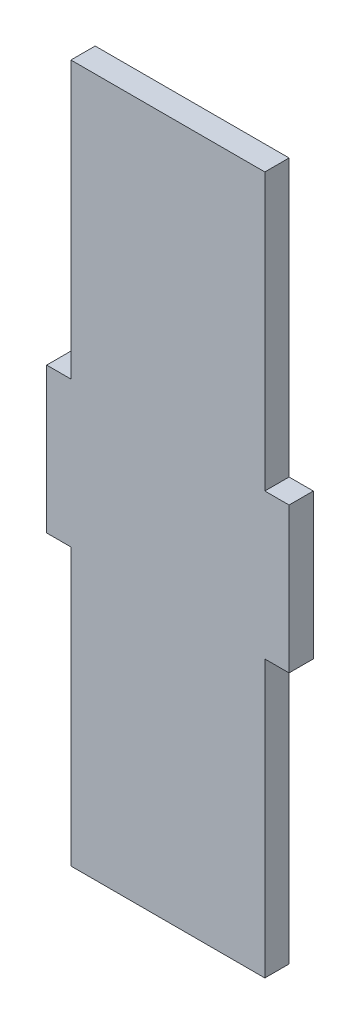
ISO-10303-21;
HEADER;
FILE_DESCRIPTION(('STEP AP214'),'2;1');
FILE_NAME('part.step','',(''),(''),'','','');
FILE_SCHEMA(('AUTOMOTIVE_DESIGN { 1 0 10303 214 1 1 1 1 }'));
ENDSEC;
DATA;
#1=APPLICATION_CONTEXT('core data for automotive mechanical design processes');
#2=APPLICATION_PROTOCOL_DEFINITION('international standard','automotive_design',2000,#1);
#3=PRODUCT_CONTEXT('',#1,'mechanical');
#4=PRODUCT('Part','Part','',(#3));
#5=PRODUCT_RELATED_PRODUCT_CATEGORY('part','',(#4));
#6=PRODUCT_DEFINITION_FORMATION('','',#4);
#7=PRODUCT_DEFINITION_CONTEXT('part definition',#1,'design');
#8=PRODUCT_DEFINITION('design','',#6,#7);
#9=PRODUCT_DEFINITION_SHAPE('','',#8);
#10=(LENGTH_UNIT() NAMED_UNIT(*) SI_UNIT(.MILLI.,.METRE.));
#11=(NAMED_UNIT(*) PLANE_ANGLE_UNIT() SI_UNIT($,.RADIAN.));
#12=(NAMED_UNIT(*) SI_UNIT($,.STERADIAN.) SOLID_ANGLE_UNIT());
#13=UNCERTAINTY_MEASURE_WITH_UNIT(LENGTH_MEASURE(1.E-05),#10,'distance_accuracy_value','');
#14=(GEOMETRIC_REPRESENTATION_CONTEXT(3) GLOBAL_UNCERTAINTY_ASSIGNED_CONTEXT((#13)) GLOBAL_UNIT_ASSIGNED_CONTEXT((#10,
#11,#12)) REPRESENTATION_CONTEXT('',''));
#15=CARTESIAN_POINT('',(0.,0.,0.));
#16=DIRECTION('',(0.,0.,1.));
#17=DIRECTION('',(1.,0.,0.));
#18=AXIS2_PLACEMENT_3D('',#15,#16,#17);
#19=CARTESIAN_POINT('',(20.,15.,5.));
#20=DIRECTION('',(-1.,0.,0.));
#21=DIRECTION('',(0.,0.,1.));
#22=AXIS2_PLACEMENT_3D('',#19,#20,#21);
#23=PLANE('',#22);
#24=DIRECTION('',(0.,1.,0.));
#25=VECTOR('',#24,1.);
#26=CARTESIAN_POINT('',(20.,15.,0.));
#27=LINE('',#26,#25);
#28=CARTESIAN_POINT('',(20.,15.,0.));
#29=VERTEX_POINT('',#28);
#30=CARTESIAN_POINT('',(20.,72.,0.));
#31=VERTEX_POINT('',#30);
#32=EDGE_CURVE('E153',#29,#31,#27,.T.);
#33=ORIENTED_EDGE('',*,*,#32,.T.);
#34=DIRECTION('',(0.,0.,-1.));
#35=VECTOR('',#34,1.);
#36=CARTESIAN_POINT('',(20.,72.,5.));
#37=LINE('',#36,#35);
#38=CARTESIAN_POINT('',(20.,72.,5.));
#39=VERTEX_POINT('',#38);
#40=EDGE_CURVE('E11',#39,#31,#37,.T.);
#41=ORIENTED_EDGE('',*,*,#40,.F.);
#42=DIRECTION('',(0.,1.,0.));
#43=VECTOR('',#42,1.);
#44=CARTESIAN_POINT('',(20.,15.,5.));
#45=LINE('',#44,#43);
#46=CARTESIAN_POINT('',(20.,15.,5.));
#47=VERTEX_POINT('',#46);
#48=EDGE_CURVE('E175',#47,#39,#45,.T.);
#49=ORIENTED_EDGE('',*,*,#48,.F.);
#50=DIRECTION('',(0.,0.,-1.));
#51=VECTOR('',#50,1.);
#52=CARTESIAN_POINT('',(20.,15.,5.));
#53=LINE('',#52,#51);
#54=EDGE_CURVE('E149',#47,#29,#53,.T.);
#55=ORIENTED_EDGE('',*,*,#54,.T.);
#56=EDGE_LOOP('',(#33,#41,#49,#55));
#57=FACE_BOUND('',#56,.T.);
#58=ADVANCED_FACE('F33',(#57),#23,.F.);
#59=CARTESIAN_POINT('',(-20.,72.,5.));
#60=DIRECTION('',(0.,-1.,0.));
#61=DIRECTION('',(0.,0.,-1.));
#62=AXIS2_PLACEMENT_3D('',#59,#60,#61);
#63=PLANE('',#62);
#64=DIRECTION('',(-1.,0.,0.));
#65=VECTOR('',#64,1.);
#66=CARTESIAN_POINT('',(-20.,72.,0.));
#67=LINE('',#66,#65);
#68=CARTESIAN_POINT('',(-20.,72.,0.));
#69=VERTEX_POINT('',#68);
#70=EDGE_CURVE('E156',#31,#69,#67,.T.);
#71=ORIENTED_EDGE('',*,*,#70,.T.);
#72=DIRECTION('',(0.,0.,-1.));
#73=VECTOR('',#72,1.);
#74=CARTESIAN_POINT('',(-20.,72.,5.));
#75=LINE('',#74,#73);
#76=CARTESIAN_POINT('',(-20.,72.,5.));
#77=VERTEX_POINT('',#76);
#78=EDGE_CURVE('E41',#77,#69,#75,.T.);
#79=ORIENTED_EDGE('',*,*,#78,.F.);
#80=DIRECTION('',(-1.,0.,0.));
#81=VECTOR('',#80,1.);
#82=CARTESIAN_POINT('',(-20.,72.,5.));
#83=LINE('',#82,#81);
#84=EDGE_CURVE('E104',#39,#77,#83,.T.);
#85=ORIENTED_EDGE('',*,*,#84,.F.);
#86=ORIENTED_EDGE('',*,*,#40,.T.);
#87=EDGE_LOOP('',(#71,#79,#85,#86));
#88=FACE_BOUND('',#87,.T.);
#89=ADVANCED_FACE('F253',(#88),#63,.F.);
#90=CARTESIAN_POINT('',(-20.,15.,5.));
#91=DIRECTION('',(1.,0.,0.));
#92=DIRECTION('',(0.,0.,-1.));
#93=AXIS2_PLACEMENT_3D('',#90,#91,#92);
#94=PLANE('',#93);
#95=DIRECTION('',(0.,-1.,0.));
#96=VECTOR('',#95,1.);
#97=CARTESIAN_POINT('',(-20.,15.,0.));
#98=LINE('',#97,#96);
#99=CARTESIAN_POINT('',(-20.,15.,0.));
#100=VERTEX_POINT('',#99);
#101=EDGE_CURVE('E158',#69,#100,#98,.T.);
#102=ORIENTED_EDGE('',*,*,#101,.T.);
#103=DIRECTION('',(0.,0.,-1.));
#104=VECTOR('',#103,1.);
#105=CARTESIAN_POINT('',(-20.,15.,5.));
#106=LINE('',#105,#104);
#107=CARTESIAN_POINT('',(-20.,15.,5.));
#108=VERTEX_POINT('',#107);
#109=EDGE_CURVE('E194',#108,#100,#106,.T.);
#110=ORIENTED_EDGE('',*,*,#109,.F.);
#111=DIRECTION('',(0.,-1.,0.));
#112=VECTOR('',#111,1.);
#113=CARTESIAN_POINT('',(-20.,15.,5.));
#114=LINE('',#113,#112);
#115=EDGE_CURVE('E202',#77,#108,#114,.T.);
#116=ORIENTED_EDGE('',*,*,#115,.F.);
#117=ORIENTED_EDGE('',*,*,#78,.T.);
#118=EDGE_LOOP('',(#102,#110,#116,#117));
#119=FACE_BOUND('',#118,.T.);
#120=ADVANCED_FACE('F200',(#119),#94,.F.);
#121=CARTESIAN_POINT('',(-20.,15.,5.));
#122=DIRECTION('',(0.,-1.,0.));
#123=DIRECTION('',(0.,0.,-1.));
#124=AXIS2_PLACEMENT_3D('',#121,#122,#123);
#125=PLANE('',#124);
#126=DIRECTION('',(-1.,0.,0.));
#127=VECTOR('',#126,1.);
#128=CARTESIAN_POINT('',(-20.,15.,0.));
#129=LINE('',#128,#127);
#130=CARTESIAN_POINT('',(-25.,15.,0.));
#131=VERTEX_POINT('',#130);
#132=EDGE_CURVE('E160',#100,#131,#129,.T.);
#133=ORIENTED_EDGE('',*,*,#132,.T.);
#134=DIRECTION('',(0.,0.,-1.));
#135=VECTOR('',#134,1.);
#136=CARTESIAN_POINT('',(-25.,15.,5.));
#137=LINE('',#136,#135);
#138=CARTESIAN_POINT('',(-25.,15.,5.));
#139=VERTEX_POINT('',#138);
#140=EDGE_CURVE('E191',#139,#131,#137,.T.);
#141=ORIENTED_EDGE('',*,*,#140,.F.);
#142=DIRECTION('',(-1.,0.,0.));
#143=VECTOR('',#142,1.);
#144=CARTESIAN_POINT('',(-20.,15.,5.));
#145=LINE('',#144,#143);
#146=EDGE_CURVE('E220',#108,#139,#145,.T.);
#147=ORIENTED_EDGE('',*,*,#146,.F.);
#148=ORIENTED_EDGE('',*,*,#109,.T.);
#149=EDGE_LOOP('',(#133,#141,#147,#148));
#150=FACE_BOUND('',#149,.T.);
#151=ADVANCED_FACE('F211',(#150),#125,.F.);
#152=CARTESIAN_POINT('',(-25.,15.,5.));
#153=DIRECTION('',(1.,0.,0.));
#154=DIRECTION('',(0.,1.,0.));
#155=AXIS2_PLACEMENT_3D('',#152,#153,#154);
#156=PLANE('',#155);
#157=DIRECTION('',(0.,-1.,0.));
#158=VECTOR('',#157,1.);
#159=CARTESIAN_POINT('',(-25.,15.,0.));
#160=LINE('',#159,#158);
#161=CARTESIAN_POINT('',(-25.,-15.,0.));
#162=VERTEX_POINT('',#161);
#163=EDGE_CURVE('E162',#131,#162,#160,.T.);
#164=ORIENTED_EDGE('',*,*,#163,.T.);
#165=DIRECTION('',(0.,0.,-1.));
#166=VECTOR('',#165,1.);
#167=CARTESIAN_POINT('',(-25.,-15.,5.));
#168=LINE('',#167,#166);
#169=CARTESIAN_POINT('',(-25.,-15.,5.));
#170=VERTEX_POINT('',#169);
#171=EDGE_CURVE('E188',#170,#162,#168,.T.);
#172=ORIENTED_EDGE('',*,*,#171,.F.);
#173=DIRECTION('',(0.,-1.,0.));
#174=VECTOR('',#173,1.);
#175=CARTESIAN_POINT('',(-25.,15.,5.));
#176=LINE('',#175,#174);
#177=EDGE_CURVE('E217',#139,#170,#176,.T.);
#178=ORIENTED_EDGE('',*,*,#177,.F.);
#179=ORIENTED_EDGE('',*,*,#140,.T.);
#180=EDGE_LOOP('',(#164,#172,#178,#179));
#181=FACE_BOUND('',#180,.T.);
#182=ADVANCED_FACE('F215',(#181),#156,.F.);
#183=CARTESIAN_POINT('',(-25.,-15.,5.));
#184=DIRECTION('',(0.,1.,0.));
#185=DIRECTION('',(0.,0.,1.));
#186=AXIS2_PLACEMENT_3D('',#183,#184,#185);
#187=PLANE('',#186);
#188=DIRECTION('',(1.,0.,0.));
#189=VECTOR('',#188,1.);
#190=CARTESIAN_POINT('',(-25.,-15.,0.));
#191=LINE('',#190,#189);
#192=CARTESIAN_POINT('',(-20.,-15.,0.));
#193=VERTEX_POINT('',#192);
#194=EDGE_CURVE('E164',#162,#193,#191,.T.);
#195=ORIENTED_EDGE('',*,*,#194,.T.);
#196=DIRECTION('',(0.,0.,-1.));
#197=VECTOR('',#196,1.);
#198=CARTESIAN_POINT('',(-20.,-15.,5.));
#199=LINE('',#198,#197);
#200=CARTESIAN_POINT('',(-20.,-15.,5.));
#201=VERTEX_POINT('',#200);
#202=EDGE_CURVE('E185',#201,#193,#199,.T.);
#203=ORIENTED_EDGE('',*,*,#202,.F.);
#204=DIRECTION('',(1.,0.,0.));
#205=VECTOR('',#204,1.);
#206=CARTESIAN_POINT('',(-25.,-15.,5.));
#207=LINE('',#206,#205);
#208=EDGE_CURVE('E219',#170,#201,#207,.T.);
#209=ORIENTED_EDGE('',*,*,#208,.F.);
#210=ORIENTED_EDGE('',*,*,#171,.T.);
#211=EDGE_LOOP('',(#195,#203,#209,#210));
#212=FACE_BOUND('',#211,.T.);
#213=ADVANCED_FACE('F266',(#212),#187,.F.);
#214=CARTESIAN_POINT('',(-20.,-72.,5.));
#215=DIRECTION('',(1.,0.,0.));
#216=DIRECTION('',(0.,0.,-1.));
#217=AXIS2_PLACEMENT_3D('',#214,#215,#216);
#218=PLANE('',#217);
#219=DIRECTION('',(0.,-1.,0.));
#220=VECTOR('',#219,1.);
#221=CARTESIAN_POINT('',(-20.,-72.,0.));
#222=LINE('',#221,#220);
#223=CARTESIAN_POINT('',(-20.,-72.,0.));
#224=VERTEX_POINT('',#223);
#225=EDGE_CURVE('E166',#193,#224,#222,.T.);
#226=ORIENTED_EDGE('',*,*,#225,.T.);
#227=DIRECTION('',(0.,0.,-1.));
#228=VECTOR('',#227,1.);
#229=CARTESIAN_POINT('',(-20.,-72.,5.));
#230=LINE('',#229,#228);
#231=CARTESIAN_POINT('',(-20.,-72.,5.));
#232=VERTEX_POINT('',#231);
#233=EDGE_CURVE('E182',#232,#224,#230,.T.);
#234=ORIENTED_EDGE('',*,*,#233,.F.);
#235=DIRECTION('',(0.,-1.,0.));
#236=VECTOR('',#235,1.);
#237=CARTESIAN_POINT('',(-20.,-72.,5.));
#238=LINE('',#237,#236);
#239=EDGE_CURVE('E222',#201,#232,#238,.T.);
#240=ORIENTED_EDGE('',*,*,#239,.F.);
#241=ORIENTED_EDGE('',*,*,#202,.T.);
#242=EDGE_LOOP('',(#226,#234,#240,#241));
#243=FACE_BOUND('',#242,.T.);
#244=ADVANCED_FACE('F269',(#243),#218,.F.);
#245=CARTESIAN_POINT('',(-20.,-72.,5.));
#246=DIRECTION('',(0.,1.,0.));
#247=DIRECTION('',(0.,0.,1.));
#248=AXIS2_PLACEMENT_3D('',#245,#246,#247);
#249=PLANE('',#248);
#250=DIRECTION('',(1.,0.,0.));
#251=VECTOR('',#250,1.);
#252=CARTESIAN_POINT('',(-20.,-72.,0.));
#253=LINE('',#252,#251);
#254=CARTESIAN_POINT('',(20.,-72.,0.));
#255=VERTEX_POINT('',#254);
#256=EDGE_CURVE('E168',#224,#255,#253,.T.);
#257=ORIENTED_EDGE('',*,*,#256,.T.);
#258=DIRECTION('',(0.,0.,-1.));
#259=VECTOR('',#258,1.);
#260=CARTESIAN_POINT('',(20.,-72.,5.));
#261=LINE('',#260,#259);
#262=CARTESIAN_POINT('',(20.,-72.,5.));
#263=VERTEX_POINT('',#262);
#264=EDGE_CURVE('E179',#263,#255,#261,.T.);
#265=ORIENTED_EDGE('',*,*,#264,.F.);
#266=DIRECTION('',(1.,0.,0.));
#267=VECTOR('',#266,1.);
#268=CARTESIAN_POINT('',(-20.,-72.,5.));
#269=LINE('',#268,#267);
#270=EDGE_CURVE('E228',#232,#263,#269,.T.);
#271=ORIENTED_EDGE('',*,*,#270,.F.);
#272=ORIENTED_EDGE('',*,*,#233,.T.);
#273=EDGE_LOOP('',(#257,#265,#271,#272));
#274=FACE_BOUND('',#273,.T.);
#275=ADVANCED_FACE('F234',(#274),#249,.F.);
#276=CARTESIAN_POINT('',(20.,-72.,5.));
#277=DIRECTION('',(-1.,0.,0.));
#278=DIRECTION('',(0.,0.,1.));
#279=AXIS2_PLACEMENT_3D('',#276,#277,#278);
#280=PLANE('',#279);
#281=DIRECTION('',(0.,1.,0.));
#282=VECTOR('',#281,1.);
#283=CARTESIAN_POINT('',(20.,-72.,0.));
#284=LINE('',#283,#282);
#285=CARTESIAN_POINT('',(20.,-15.,0.));
#286=VERTEX_POINT('',#285);
#287=EDGE_CURVE('E170',#255,#286,#284,.T.);
#288=ORIENTED_EDGE('',*,*,#287,.T.);
#289=DIRECTION('',(0.,0.,-1.));
#290=VECTOR('',#289,1.);
#291=CARTESIAN_POINT('',(20.,-15.,5.));
#292=LINE('',#291,#290);
#293=CARTESIAN_POINT('',(20.,-15.,5.));
#294=VERTEX_POINT('',#293);
#295=EDGE_CURVE('E144',#294,#286,#292,.T.);
#296=ORIENTED_EDGE('',*,*,#295,.F.);
#297=DIRECTION('',(0.,1.,0.));
#298=VECTOR('',#297,1.);
#299=CARTESIAN_POINT('',(20.,-72.,5.));
#300=LINE('',#299,#298);
#301=EDGE_CURVE('E135',#263,#294,#300,.T.);
#302=ORIENTED_EDGE('',*,*,#301,.F.);
#303=ORIENTED_EDGE('',*,*,#264,.T.);
#304=EDGE_LOOP('',(#288,#296,#302,#303));
#305=FACE_BOUND('',#304,.T.);
#306=ADVANCED_FACE('F238',(#305),#280,.F.);
#307=CARTESIAN_POINT('',(25.,-15.,5.));
#308=DIRECTION('',(0.,1.,0.));
#309=DIRECTION('',(0.,0.,1.));
#310=AXIS2_PLACEMENT_3D('',#307,#308,#309);
#311=PLANE('',#310);
#312=DIRECTION('',(1.,0.,0.));
#313=VECTOR('',#312,1.);
#314=CARTESIAN_POINT('',(25.,-15.,0.));
#315=LINE('',#314,#313);
#316=CARTESIAN_POINT('',(25.,-15.,0.));
#317=VERTEX_POINT('',#316);
#318=EDGE_CURVE('E143',#286,#317,#315,.T.);
#319=ORIENTED_EDGE('',*,*,#318,.T.);
#320=DIRECTION('',(0.,0.,-1.));
#321=VECTOR('',#320,1.);
#322=CARTESIAN_POINT('',(25.,-15.,5.));
#323=LINE('',#322,#321);
#324=CARTESIAN_POINT('',(25.,-15.,5.));
#325=VERTEX_POINT('',#324);
#326=EDGE_CURVE('E140',#325,#317,#323,.T.);
#327=ORIENTED_EDGE('',*,*,#326,.F.);
#328=DIRECTION('',(1.,0.,0.));
#329=VECTOR('',#328,1.);
#330=CARTESIAN_POINT('',(25.,-15.,5.));
#331=LINE('',#330,#329);
#332=EDGE_CURVE('E129',#294,#325,#331,.T.);
#333=ORIENTED_EDGE('',*,*,#332,.F.);
#334=ORIENTED_EDGE('',*,*,#295,.T.);
#335=EDGE_LOOP('',(#319,#327,#333,#334));
#336=FACE_BOUND('',#335,.T.);
#337=ADVANCED_FACE('F141',(#336),#311,.F.);
#338=CARTESIAN_POINT('',(25.,15.,5.));
#339=DIRECTION('',(-1.,0.,0.));
#340=DIRECTION('',(0.,-1.,0.));
#341=AXIS2_PLACEMENT_3D('',#338,#339,#340);
#342=PLANE('',#341);
#343=DIRECTION('',(0.,1.,0.));
#344=VECTOR('',#343,1.);
#345=CARTESIAN_POINT('',(25.,15.,0.));
#346=LINE('',#345,#344);
#347=CARTESIAN_POINT('',(25.,15.,0.));
#348=VERTEX_POINT('',#347);
#349=EDGE_CURVE('E90',#317,#348,#346,.T.);
#350=ORIENTED_EDGE('',*,*,#349,.T.);
#351=DIRECTION('',(0.,0.,-1.));
#352=VECTOR('',#351,1.);
#353=CARTESIAN_POINT('',(25.,15.,5.));
#354=LINE('',#353,#352);
#355=CARTESIAN_POINT('',(25.,15.,5.));
#356=VERTEX_POINT('',#355);
#357=EDGE_CURVE('E145',#356,#348,#354,.T.);
#358=ORIENTED_EDGE('',*,*,#357,.F.);
#359=DIRECTION('',(0.,1.,0.));
#360=VECTOR('',#359,1.);
#361=CARTESIAN_POINT('',(25.,15.,5.));
#362=LINE('',#361,#360);
#363=EDGE_CURVE('E133',#325,#356,#362,.T.);
#364=ORIENTED_EDGE('',*,*,#363,.F.);
#365=ORIENTED_EDGE('',*,*,#326,.T.);
#366=EDGE_LOOP('',(#350,#358,#364,#365));
#367=FACE_BOUND('',#366,.T.);
#368=ADVANCED_FACE('F147',(#367),#342,.F.);
#369=CARTESIAN_POINT('',(20.,15.,5.));
#370=DIRECTION('',(0.,-1.,0.));
#371=DIRECTION('',(0.,0.,-1.));
#372=AXIS2_PLACEMENT_3D('',#369,#370,#371);
#373=PLANE('',#372);
#374=DIRECTION('',(-1.,0.,0.));
#375=VECTOR('',#374,1.);
#376=CARTESIAN_POINT('',(20.,15.,0.));
#377=LINE('',#376,#375);
#378=EDGE_CURVE('E96',#348,#29,#377,.T.);
#379=ORIENTED_EDGE('',*,*,#378,.T.);
#380=ORIENTED_EDGE('',*,*,#54,.F.);
#381=DIRECTION('',(-1.,0.,0.));
#382=VECTOR('',#381,1.);
#383=CARTESIAN_POINT('',(20.,15.,5.));
#384=LINE('',#383,#382);
#385=EDGE_CURVE('E49',#356,#47,#384,.T.);
#386=ORIENTED_EDGE('',*,*,#385,.F.);
#387=ORIENTED_EDGE('',*,*,#357,.T.);
#388=EDGE_LOOP('',(#379,#380,#386,#387));
#389=FACE_BOUND('',#388,.T.);
#390=ADVANCED_FACE('F242',(#389),#373,.F.);
#391=CARTESIAN_POINT('',(0.,0.,5.));
#392=DIRECTION('',(0.,0.,-1.));
#393=DIRECTION('',(-1.,0.,0.));
#394=AXIS2_PLACEMENT_3D('',#391,#392,#393);
#395=PLANE('',#394);
#396=ORIENTED_EDGE('',*,*,#48,.T.);
#397=ORIENTED_EDGE('',*,*,#84,.T.);
#398=ORIENTED_EDGE('',*,*,#115,.T.);
#399=ORIENTED_EDGE('',*,*,#146,.T.);
#400=ORIENTED_EDGE('',*,*,#177,.T.);
#401=ORIENTED_EDGE('',*,*,#208,.T.);
#402=ORIENTED_EDGE('',*,*,#239,.T.);
#403=ORIENTED_EDGE('',*,*,#270,.T.);
#404=ORIENTED_EDGE('',*,*,#301,.T.);
#405=ORIENTED_EDGE('',*,*,#332,.T.);
#406=ORIENTED_EDGE('',*,*,#363,.T.);
#407=ORIENTED_EDGE('',*,*,#385,.T.);
#408=EDGE_LOOP('',(#396,#397,#398,#399,#400,#401,#402,#403,#404,#405,#406,#407));
#409=FACE_BOUND('',#408,.T.);
#410=ADVANCED_FACE('F131',(#409),#395,.F.);
#411=CARTESIAN_POINT('',(0.,0.,0.));
#412=DIRECTION('',(0.,0.,-1.));
#413=DIRECTION('',(-1.,0.,0.));
#414=AXIS2_PLACEMENT_3D('',#411,#412,#413);
#415=PLANE('',#414);
#416=ORIENTED_EDGE('',*,*,#32,.F.);
#417=ORIENTED_EDGE('',*,*,#378,.F.);
#418=ORIENTED_EDGE('',*,*,#349,.F.);
#419=ORIENTED_EDGE('',*,*,#318,.F.);
#420=ORIENTED_EDGE('',*,*,#287,.F.);
#421=ORIENTED_EDGE('',*,*,#256,.F.);
#422=ORIENTED_EDGE('',*,*,#225,.F.);
#423=ORIENTED_EDGE('',*,*,#194,.F.);
#424=ORIENTED_EDGE('',*,*,#163,.F.);
#425=ORIENTED_EDGE('',*,*,#132,.F.);
#426=ORIENTED_EDGE('',*,*,#101,.F.);
#427=ORIENTED_EDGE('',*,*,#70,.F.);
#428=EDGE_LOOP('',(#416,#417,#418,#419,#420,#421,#422,#423,#424,#425,#426,#427));
#429=FACE_BOUND('',#428,.T.);
#430=ADVANCED_FACE('F206',(#429),#415,.T.);
#431=CLOSED_SHELL('',(#58,#89,#120,#151,#182,#213,#244,#275,#306,#337,#368,#390,#410,#430));
#432=MANIFOLD_SOLID_BREP('B2',#431);
#433=ADVANCED_BREP_SHAPE_REPRESENTATION('',(#18,#432),#14);
#434=SHAPE_DEFINITION_REPRESENTATION(#9,#433);
ENDSEC;
END-ISO-10303-21;
